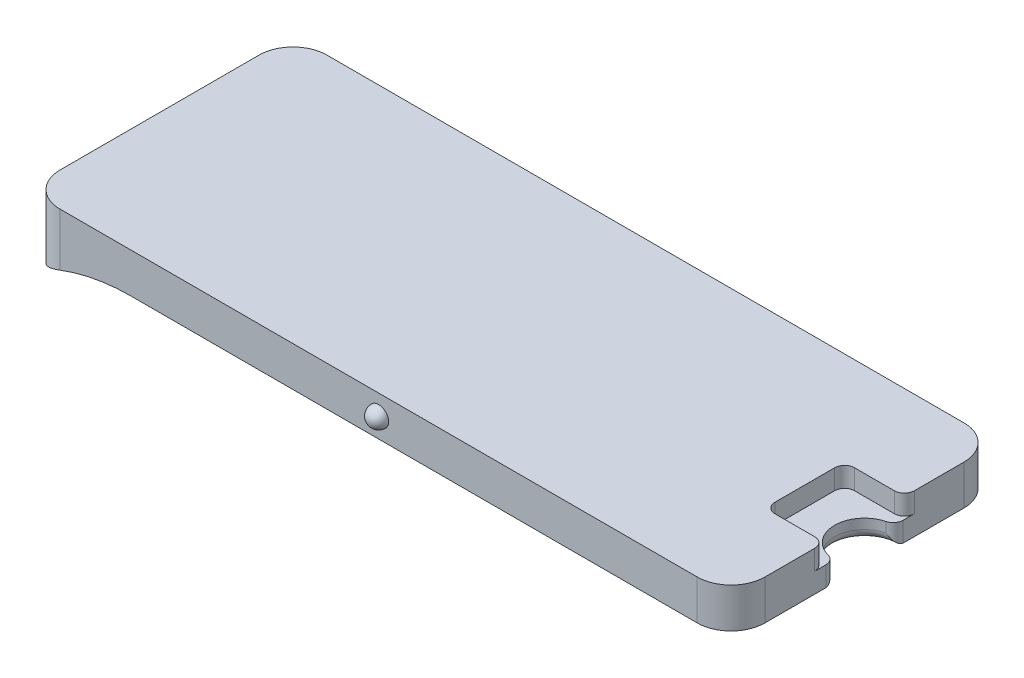
ISO-10303-21;
HEADER;
FILE_DESCRIPTION(('STEP AP214'),'2;1');
FILE_NAME('part.step','',(''),(''),'','','');
FILE_SCHEMA(('AUTOMOTIVE_DESIGN { 1 0 10303 214 1 1 1 1 }'));
ENDSEC;
DATA;
#1=APPLICATION_CONTEXT('core data for automotive mechanical design processes');
#2=APPLICATION_PROTOCOL_DEFINITION('international standard','automotive_design',2000,#1);
#3=PRODUCT_CONTEXT('',#1,'mechanical');
#4=PRODUCT('Part','Part','',(#3));
#5=PRODUCT_RELATED_PRODUCT_CATEGORY('part','',(#4));
#6=PRODUCT_DEFINITION_FORMATION('','',#4);
#7=PRODUCT_DEFINITION_CONTEXT('part definition',#1,'design');
#8=PRODUCT_DEFINITION('design','',#6,#7);
#9=PRODUCT_DEFINITION_SHAPE('','',#8);
#10=(LENGTH_UNIT() NAMED_UNIT(*) SI_UNIT(.MILLI.,.METRE.));
#11=(NAMED_UNIT(*) PLANE_ANGLE_UNIT() SI_UNIT($,.RADIAN.));
#12=(NAMED_UNIT(*) SI_UNIT($,.STERADIAN.) SOLID_ANGLE_UNIT());
#13=UNCERTAINTY_MEASURE_WITH_UNIT(LENGTH_MEASURE(1.E-05),#10,'distance_accuracy_value','');
#14=(GEOMETRIC_REPRESENTATION_CONTEXT(3) GLOBAL_UNCERTAINTY_ASSIGNED_CONTEXT((#13)) GLOBAL_UNIT_ASSIGNED_CONTEXT((#10,
#11,#12)) REPRESENTATION_CONTEXT('',''));
#15=CARTESIAN_POINT('',(0.,0.,0.));
#16=DIRECTION('',(0.,0.,1.));
#17=DIRECTION('',(1.,0.,0.));
#18=AXIS2_PLACEMENT_3D('',#15,#16,#17);
#19=CARTESIAN_POINT('',(35.7,6.,-2.));
#20=DIRECTION('',(-1.,0.,0.));
#21=DIRECTION('',(0.,0.,1.));
#22=AXIS2_PLACEMENT_3D('',#19,#20,#21);
#23=PLANE('',#22);
#24=DIRECTION('',(0.,0.,-1.));
#25=VECTOR('',#24,1.);
#26=CARTESIAN_POINT('',(35.7,5.,-9.));
#27=LINE('',#26,#25);
#28=CARTESIAN_POINT('',(35.7,5.,-8.93649167310371));
#29=VERTEX_POINT('',#28);
#30=CARTESIAN_POINT('',(35.7,5.,-9.5));
#31=VERTEX_POINT('',#30);
#32=EDGE_CURVE('E429',#29,#31,#27,.T.);
#33=ORIENTED_EDGE('',*,*,#32,.F.);
#34=DIRECTION('',(0.,-1.,0.));
#35=VECTOR('',#34,1.);
#36=CARTESIAN_POINT('',(35.7,6.,-8.93649167310371));
#37=LINE('',#36,#35);
#38=CARTESIAN_POINT('',(35.7,4.00404970771776,-8.93649167310371));
#39=VERTEX_POINT('',#38);
#40=EDGE_CURVE('E345',#29,#39,#37,.T.);
#41=ORIENTED_EDGE('',*,*,#40,.T.);
#42=CARTESIAN_POINT('',(35.7,4.5,-9.));
#43=DIRECTION('',(-1.,0.,0.));
#44=DIRECTION('',(0.,0.,1.));
#45=AXIS2_PLACEMENT_3D('',#42,#43,#44);
#46=CIRCLE('',#45,0.5);
#47=CARTESIAN_POINT('',(35.7,4.,-9.));
#48=VERTEX_POINT('',#47);
#49=EDGE_CURVE('E342',#39,#48,#46,.F.);
#50=ORIENTED_EDGE('',*,*,#49,.T.);
#51=DIRECTION('',(0.,0.,-1.));
#52=VECTOR('',#51,1.);
#53=CARTESIAN_POINT('',(35.7,4.,-0.3));
#54=LINE('',#53,#52);
#55=CARTESIAN_POINT('',(35.7,4.,-12.));
#56=VERTEX_POINT('',#55);
#57=EDGE_CURVE('E217',#48,#56,#54,.T.);
#58=ORIENTED_EDGE('',*,*,#57,.T.);
#59=DIRECTION('',(0.,-1.,0.));
#60=VECTOR('',#59,1.);
#61=CARTESIAN_POINT('',(35.7,6.,-12.));
#62=LINE('',#61,#60);
#63=CARTESIAN_POINT('',(35.7,6.,-12.));
#64=VERTEX_POINT('',#63);
#65=EDGE_CURVE('E447',#64,#56,#62,.T.);
#66=ORIENTED_EDGE('',*,*,#65,.F.);
#67=DIRECTION('',(0.,0.,-1.));
#68=VECTOR('',#67,1.);
#69=CARTESIAN_POINT('',(35.7,6.,-2.));
#70=LINE('',#69,#68);
#71=CARTESIAN_POINT('',(35.7,6.,-9.5));
#72=VERTEX_POINT('',#71);
#73=EDGE_CURVE('E444',#72,#64,#70,.T.);
#74=ORIENTED_EDGE('',*,*,#73,.F.);
#75=DIRECTION('',(0.,1.,0.));
#76=VECTOR('',#75,1.);
#77=CARTESIAN_POINT('',(35.7,6.,-9.5));
#78=LINE('',#77,#76);
#79=EDGE_CURVE('E339',#72,#31,#78,.F.);
#80=ORIENTED_EDGE('',*,*,#79,.T.);
#81=EDGE_LOOP('',(#33,#41,#50,#58,#66,#74,#80));
#82=FACE_BOUND('',#81,.T.);
#83=ADVANCED_FACE('F39',(#82),#23,.F.);
#84=CARTESIAN_POINT('',(2.00000000000001,6.,-0.3));
#85=DIRECTION('',(0.,0.,-1.));
#86=DIRECTION('',(-1.,0.,0.));
#87=AXIS2_PLACEMENT_3D('',#84,#85,#86);
#88=PLANE('',#87);
#89=CARTESIAN_POINT('',(18.,5.,-0.3));
#90=DIRECTION('',(0.,0.,-1.));
#91=DIRECTION('',(-1.,0.,0.));
#92=AXIS2_PLACEMENT_3D('',#89,#90,#91);
#93=CIRCLE('',#92,0.5);
#94=CARTESIAN_POINT('',(17.5,5.,-0.3));
#95=VERTEX_POINT('',#94);
#96=EDGE_CURVE('E492',#95,#95,#93,.F.);
#97=ORIENTED_EDGE('',*,*,#96,.F.);
#98=EDGE_LOOP('',(#97));
#99=FACE_BOUND('',#98,.T.);
#100=DIRECTION('',(-1.,0.,0.));
#101=VECTOR('',#100,1.);
#102=CARTESIAN_POINT('',(0.,4.,-0.299999999999996));
#103=LINE('',#102,#101);
#104=CARTESIAN_POINT('',(34.,4.,-0.3));
#105=VERTEX_POINT('',#104);
#106=CARTESIAN_POINT('',(5.56356447414131,4.,-0.299999999999996));
#107=VERTEX_POINT('',#106);
#108=EDGE_CURVE('E198',#105,#107,#103,.T.);
#109=ORIENTED_EDGE('',*,*,#108,.F.);
#110=DIRECTION('',(0.,-1.,0.));
#111=VECTOR('',#110,1.);
#112=CARTESIAN_POINT('',(34.,6.,-0.3));
#113=LINE('',#112,#111);
#114=CARTESIAN_POINT('',(34.,6.,-0.3));
#115=VERTEX_POINT('',#114);
#116=EDGE_CURVE('E480',#115,#105,#113,.T.);
#117=ORIENTED_EDGE('',*,*,#116,.F.);
#118=DIRECTION('',(1.,0.,0.));
#119=VECTOR('',#118,1.);
#120=CARTESIAN_POINT('',(2.00000000000001,6.,-0.3));
#121=LINE('',#120,#119);
#122=CARTESIAN_POINT('',(2.00000000000001,6.,-0.3));
#123=VERTEX_POINT('',#122);
#124=EDGE_CURVE('E454',#123,#115,#121,.T.);
#125=ORIENTED_EDGE('',*,*,#124,.F.);
#126=DIRECTION('',(0.,-1.,0.));
#127=VECTOR('',#126,1.);
#128=CARTESIAN_POINT('',(2.00000000000001,6.,-0.3));
#129=LINE('',#128,#127);
#130=CARTESIAN_POINT('',(2.00000000000001,3.34350085560214,-0.299999999999996));
#131=VERTEX_POINT('',#130);
#132=EDGE_CURVE('E222',#123,#131,#129,.T.);
#133=ORIENTED_EDGE('',*,*,#132,.T.);
#134=CARTESIAN_POINT('',(5.56356447414131,-6.,-0.299999999999996));
#135=DIRECTION('',(0.,0.,-1.));
#136=DIRECTION('',(-1.,0.,0.));
#137=AXIS2_PLACEMENT_3D('',#134,#135,#136);
#138=CIRCLE('',#137,10.);
#139=EDGE_CURVE('E210',#131,#107,#138,.T.);
#140=ORIENTED_EDGE('',*,*,#139,.T.);
#141=EDGE_LOOP('',(#109,#117,#125,#133,#140));
#142=FACE_BOUND('',#141,.T.);
#143=ADVANCED_FACE('F220',(#99,#142),#88,.F.);
#144=CARTESIAN_POINT('',(34.,6.,-2.));
#145=DIRECTION('',(0.,-1.,0.));
#146=DIRECTION('',(0.,0.,-1.));
#147=AXIS2_PLACEMENT_3D('',#144,#145,#146);
#148=CYLINDRICAL_SURFACE('',#147,1.7);
#149=CARTESIAN_POINT('',(34.,4.,-2.));
#150=DIRECTION('',(0.,-1.,0.));
#151=DIRECTION('',(1.,0.,0.));
#152=AXIS2_PLACEMENT_3D('',#149,#150,#151);
#153=CIRCLE('',#152,1.7);
#154=CARTESIAN_POINT('',(35.7,4.,-2.));
#155=VERTEX_POINT('',#154);
#156=EDGE_CURVE('E205',#155,#105,#153,.T.);
#157=ORIENTED_EDGE('',*,*,#156,.F.);
#158=DIRECTION('',(0.,-1.,0.));
#159=VECTOR('',#158,1.);
#160=CARTESIAN_POINT('',(35.7,6.,-2.));
#161=LINE('',#160,#159);
#162=CARTESIAN_POINT('',(35.7,6.,-2.));
#163=VERTEX_POINT('',#162);
#164=EDGE_CURVE('E478',#163,#155,#161,.T.);
#165=ORIENTED_EDGE('',*,*,#164,.F.);
#166=CARTESIAN_POINT('',(34.,6.,-2.));
#167=DIRECTION('',(0.,1.,0.));
#168=DIRECTION('',(0.,0.,-1.));
#169=AXIS2_PLACEMENT_3D('',#166,#167,#168);
#170=CIRCLE('',#169,1.7);
#171=EDGE_CURVE('E450',#115,#163,#170,.T.);
#172=ORIENTED_EDGE('',*,*,#171,.F.);
#173=ORIENTED_EDGE('',*,*,#116,.T.);
#174=EDGE_LOOP('',(#157,#165,#172,#173));
#175=FACE_BOUND('',#174,.T.);
#176=ADVANCED_FACE('F285',(#175),#148,.T.);
#177=CARTESIAN_POINT('',(35.7,4.5,-5.));
#178=DIRECTION('',(-1.,0.,0.));
#179=DIRECTION('',(0.,0.,1.));
#180=AXIS2_PLACEMENT_3D('',#177,#178,#179);
#181=CIRCLE('',#180,0.5);
#182=CARTESIAN_POINT('',(35.7,4.,-5.));
#183=VERTEX_POINT('',#182);
#184=CARTESIAN_POINT('',(35.7,4.00404970771776,-5.06350832689629));
#185=VERTEX_POINT('',#184);
#186=EDGE_CURVE('E303',#183,#185,#181,.F.);
#187=ORIENTED_EDGE('',*,*,#186,.T.);
#188=DIRECTION('',(0.,-1.,0.));
#189=VECTOR('',#188,1.);
#190=CARTESIAN_POINT('',(35.7,6.,-5.06350832689629));
#191=LINE('',#190,#189);
#192=CARTESIAN_POINT('',(35.7,5.,-5.06350832689629));
#193=VERTEX_POINT('',#192);
#194=EDGE_CURVE('E306',#185,#193,#191,.F.);
#195=ORIENTED_EDGE('',*,*,#194,.T.);
#196=CARTESIAN_POINT('',(35.7,5.,-4.5));
#197=VERTEX_POINT('',#196);
#198=EDGE_CURVE('E431',#197,#193,#27,.T.);
#199=ORIENTED_EDGE('',*,*,#198,.F.);
#200=DIRECTION('',(0.,1.,0.));
#201=VECTOR('',#200,1.);
#202=CARTESIAN_POINT('',(35.7,6.,-4.5));
#203=LINE('',#202,#201);
#204=CARTESIAN_POINT('',(35.7,6.,-4.5));
#205=VERTEX_POINT('',#204);
#206=EDGE_CURVE('E311',#197,#205,#203,.T.);
#207=ORIENTED_EDGE('',*,*,#206,.T.);
#208=EDGE_CURVE('E449',#163,#205,#70,.T.);
#209=ORIENTED_EDGE('',*,*,#208,.F.);
#210=ORIENTED_EDGE('',*,*,#164,.T.);
#211=EDGE_CURVE('E232',#155,#183,#54,.T.);
#212=ORIENTED_EDGE('',*,*,#211,.T.);
#213=EDGE_LOOP('',(#187,#195,#199,#207,#209,#210,#212));
#214=FACE_BOUND('',#213,.T.);
#215=ADVANCED_FACE('F279',(#214),#23,.F.);
#216=CARTESIAN_POINT('',(34.,6.,-12.));
#217=DIRECTION('',(0.,-1.,0.));
#218=DIRECTION('',(0.,0.,-1.));
#219=AXIS2_PLACEMENT_3D('',#216,#217,#218);
#220=CYLINDRICAL_SURFACE('',#219,1.7);
#221=CARTESIAN_POINT('',(34.,4.,-12.));
#222=DIRECTION('',(0.,-1.,0.));
#223=DIRECTION('',(1.,0.,0.));
#224=AXIS2_PLACEMENT_3D('',#221,#222,#223);
#225=CIRCLE('',#224,1.7);
#226=CARTESIAN_POINT('',(34.,4.,-13.7));
#227=VERTEX_POINT('',#226);
#228=EDGE_CURVE('E505',#227,#56,#225,.T.);
#229=ORIENTED_EDGE('',*,*,#228,.F.);
#230=DIRECTION('',(0.,-1.,0.));
#231=VECTOR('',#230,1.);
#232=CARTESIAN_POINT('',(34.,6.,-13.7));
#233=LINE('',#232,#231);
#234=CARTESIAN_POINT('',(34.,6.,-13.7));
#235=VERTEX_POINT('',#234);
#236=EDGE_CURVE('E474',#235,#227,#233,.T.);
#237=ORIENTED_EDGE('',*,*,#236,.F.);
#238=CARTESIAN_POINT('',(34.,6.,-12.));
#239=DIRECTION('',(0.,1.,0.));
#240=DIRECTION('',(0.,0.,1.));
#241=AXIS2_PLACEMENT_3D('',#238,#239,#240);
#242=CIRCLE('',#241,1.7);
#243=EDGE_CURVE('E453',#64,#235,#242,.T.);
#244=ORIENTED_EDGE('',*,*,#243,.F.);
#245=ORIENTED_EDGE('',*,*,#65,.T.);
#246=EDGE_LOOP('',(#229,#237,#244,#245));
#247=FACE_BOUND('',#246,.T.);
#248=ADVANCED_FACE('F291',(#247),#220,.T.);
#249=CARTESIAN_POINT('',(2.,6.,-13.7));
#250=DIRECTION('',(0.,0.,1.));
#251=DIRECTION('',(1.,0.,0.));
#252=AXIS2_PLACEMENT_3D('',#249,#250,#251);
#253=PLANE('',#252);
#254=CARTESIAN_POINT('',(18.,5.,-13.7));
#255=DIRECTION('',(0.,0.,1.));
#256=DIRECTION('',(1.,0.,0.));
#257=AXIS2_PLACEMENT_3D('',#254,#255,#256);
#258=CIRCLE('',#257,0.5);
#259=CARTESIAN_POINT('',(18.5,5.,-13.7));
#260=VERTEX_POINT('',#259);
#261=EDGE_CURVE('E486',#260,#260,#258,.F.);
#262=ORIENTED_EDGE('',*,*,#261,.F.);
#263=EDGE_LOOP('',(#262));
#264=FACE_BOUND('',#263,.T.);
#265=DIRECTION('',(-1.,0.,0.));
#266=VECTOR('',#265,1.);
#267=CARTESIAN_POINT('',(0.,4.,-13.7));
#268=LINE('',#267,#266);
#269=CARTESIAN_POINT('',(5.56356447414131,4.,-13.7));
#270=VERTEX_POINT('',#269);
#271=EDGE_CURVE('E223',#227,#270,#268,.T.);
#272=ORIENTED_EDGE('',*,*,#271,.T.);
#273=CARTESIAN_POINT('',(5.56356447414131,-6.,-13.7));
#274=DIRECTION('',(0.,0.,-1.));
#275=DIRECTION('',(-1.,0.,0.));
#276=AXIS2_PLACEMENT_3D('',#273,#274,#275);
#277=CIRCLE('',#276,10.);
#278=CARTESIAN_POINT('',(2.,3.34350085560214,-13.7));
#279=VERTEX_POINT('',#278);
#280=EDGE_CURVE('E216',#279,#270,#277,.T.);
#281=ORIENTED_EDGE('',*,*,#280,.F.);
#282=DIRECTION('',(0.,-1.,0.));
#283=VECTOR('',#282,1.);
#284=CARTESIAN_POINT('',(2.,6.,-13.7));
#285=LINE('',#284,#283);
#286=CARTESIAN_POINT('',(2.,6.,-13.7));
#287=VERTEX_POINT('',#286);
#288=EDGE_CURVE('E471',#287,#279,#285,.T.);
#289=ORIENTED_EDGE('',*,*,#288,.F.);
#290=DIRECTION('',(-1.,0.,0.));
#291=VECTOR('',#290,1.);
#292=CARTESIAN_POINT('',(2.,6.,-13.7));
#293=LINE('',#292,#291);
#294=EDGE_CURVE('E459',#235,#287,#293,.T.);
#295=ORIENTED_EDGE('',*,*,#294,.F.);
#296=ORIENTED_EDGE('',*,*,#236,.T.);
#297=EDGE_LOOP('',(#272,#281,#289,#295,#296));
#298=FACE_BOUND('',#297,.T.);
#299=ADVANCED_FACE('F297',(#264,#298),#253,.F.);
#300=CARTESIAN_POINT('',(2.,6.,-2.));
#301=DIRECTION('',(0.,-1.,0.));
#302=DIRECTION('',(0.,0.,-1.));
#303=AXIS2_PLACEMENT_3D('',#300,#301,#302);
#304=CYLINDRICAL_SURFACE('',#303,1.7);
#305=DIRECTION('',(0.,-1.,0.));
#306=VECTOR('',#305,1.);
#307=CARTESIAN_POINT('',(0.3,6.,-2.00000000000001));
#308=LINE('',#307,#306);
#309=CARTESIAN_POINT('',(0.3,6.,-2.00000000000001));
#310=VERTEX_POINT('',#309);
#311=CARTESIAN_POINT('',(0.3,2.50264012095993,-2.00000000000001));
#312=VERTEX_POINT('',#311);
#313=EDGE_CURVE('E465',#310,#312,#308,.T.);
#314=ORIENTED_EDGE('',*,*,#313,.T.);
#315=CARTESIAN_POINT('',(0.3,2.50264012095993,-2.00000000000001));
#316=CARTESIAN_POINT('',(0.299992088526312,2.50263250156881,-1.95678362515802));
#317=CARTESIAN_POINT('',(0.301647690929297,2.50366006360953,-1.91357279448062));
#318=CARTESIAN_POINT('',(0.308224758263679,2.50772776157053,-1.82751564458058));
#319=CARTESIAN_POINT('',(0.31314467794515,2.51076694523549,-1.784669162599));
#320=CARTESIAN_POINT('',(0.326154818890052,2.51877895107439,-1.69987747715473));
#321=CARTESIAN_POINT('',(0.334228132251549,2.52374145966233,-1.65792870504246));
#322=CARTESIAN_POINT('',(0.353429568358974,2.53549181946785,-1.57500643976369));
#323=CARTESIAN_POINT('',(0.364557923805424,2.54227980973035,-1.53403302114767));
#324=CARTESIAN_POINT('',(0.402291671563425,2.5651698553777,-1.41311619137803));
#325=CARTESIAN_POINT('',(0.433278566370444,2.58381862292436,-1.33496744687166));
#326=CARTESIAN_POINT('',(0.505629285829037,2.62664769482306,-1.18526401776579));
#327=CARTESIAN_POINT('',(0.547005658001135,2.65083468463093,-1.11371745063029));
#328=CARTESIAN_POINT('',(0.641988142789804,2.70524443898162,-0.973620414061437));
#329=CARTESIAN_POINT('',(0.696249026896962,2.73577178135987,-0.905633155991113));
#330=CARTESIAN_POINT('',(0.813515411197208,2.80008576541857,-0.779474437184878));
#331=CARTESIAN_POINT('',(0.876524533238714,2.83387375526024,-0.721307064185352));
#332=CARTESIAN_POINT('',(1.019051832355,2.90812555071934,-0.608199277374127));
#333=CARTESIAN_POINT('',(1.09964892968965,2.94886909809408,-0.554797721102043));
#334=CARTESIAN_POINT('',(1.26838831125863,3.03107285023993,-0.462469042166749));
#335=CARTESIAN_POINT('',(1.35653148750248,3.07253313927232,-0.423543633619444));
#336=CARTESIAN_POINT('',(1.53562179025118,3.15341503303893,-0.362006866611179));
#337=CARTESIAN_POINT('',(1.62639383526513,3.19285976533429,-0.338921406706068));
#338=CARTESIAN_POINT('',(1.76498924936879,3.25058637639422,-0.315668902807397));
#339=CARTESIAN_POINT('',(1.81161528615953,3.26959665612123,-0.309813945833303));
#340=CARTESIAN_POINT('',(1.90544027189988,3.30702339044014,-0.301979678796387));
#341=CARTESIAN_POINT('',(1.95263935663324,3.32543970035591,-0.30000130606422));
#342=CARTESIAN_POINT('',(2.00000000000001,3.34350085560214,-0.3));
#343=B_SPLINE_CURVE_WITH_KNOTS('',3,(#315,#316,#317,#318,#319,#320,#321,#322,#323,#324,#325,
#326,#327,#328,#329,#330,#331,#332,#333,#334,#335,#336,#337,#338,#339,#340,#341,#342),
.UNSPECIFIED.,.F.,.F.,(4,2,2,2,2,2,2,2,2,2,2,2,2,4),(0.,0.129596054597615,0.25913080524233,
0.38798034410827,0.516839700082238,0.773929553596661,1.03133140428817,1.3068088043476,
1.58240059649021,1.89582060505091,2.20927771376466,2.51288731577628,2.66482771633682,
2.81680485048054),.UNSPECIFIED.);
#344=EDGE_CURVE('E244',#312,#131,#343,.T.);
#345=ORIENTED_EDGE('',*,*,#344,.T.);
#346=ORIENTED_EDGE('',*,*,#132,.F.);
#347=CARTESIAN_POINT('',(2.,6.,-2.));
#348=DIRECTION('',(0.,1.,0.));
#349=DIRECTION('',(0.,0.,1.));
#350=AXIS2_PLACEMENT_3D('',#347,#348,#349);
#351=CIRCLE('',#350,1.7);
#352=EDGE_CURVE('E504',#310,#123,#351,.T.);
#353=ORIENTED_EDGE('',*,*,#352,.F.);
#354=EDGE_LOOP('',(#314,#345,#346,#353));
#355=FACE_BOUND('',#354,.T.);
#356=ADVANCED_FACE('F272',(#355),#304,.T.);
#357=CARTESIAN_POINT('',(2.,6.,-12.));
#358=DIRECTION('',(0.,-1.,0.));
#359=DIRECTION('',(0.,0.,-1.));
#360=AXIS2_PLACEMENT_3D('',#357,#358,#359);
#361=CYLINDRICAL_SURFACE('',#360,1.7);
#362=ORIENTED_EDGE('',*,*,#288,.T.);
#363=CARTESIAN_POINT('',(2.,3.34350085560214,-13.7));
#364=CARTESIAN_POINT('',(1.94792819045312,3.32364375244172,-13.6999980232305));
#365=CARTESIAN_POINT('',(1.89605549079867,3.30335776435633,-13.6976067884927));
#366=CARTESIAN_POINT('',(1.79303683749702,3.26208355128369,-13.6881481374563));
#367=CARTESIAN_POINT('',(1.74189068055667,3.24109552847475,-13.6810820566394));
#368=CARTESIAN_POINT('',(1.5901615264663,3.17736619294704,-13.6530545575874));
#369=CARTESIAN_POINT('',(1.49110935180458,3.1337913366733,-13.6252631614737));
#370=CARTESIAN_POINT('',(1.29992431149841,3.04612932773585,-13.5525348779413));
#371=CARTESIAN_POINT('',(1.20778705310864,3.00204252120489,-13.5076089875647));
#372=CARTESIAN_POINT('',(1.03254452622709,2.91512334063785,-13.4016120521645));
#373=CARTESIAN_POINT('',(0.949443647760335,2.87229158364213,-13.3405332087798));
#374=CARTESIAN_POINT('',(0.793955205982153,2.7896904782686,-13.2026443682722));
#375=CARTESIAN_POINT('',(0.721677261953914,2.74995419649219,-13.125690031179));
#376=CARTESIAN_POINT('',(0.591525964679095,2.67665941554074,-12.957846171416));
#377=CARTESIAN_POINT('',(0.533646198947455,2.6430981679445,-12.8669628815046));
#378=CARTESIAN_POINT('',(0.439788704568335,2.58776130195992,-12.6822330343962));
#379=CARTESIAN_POINT('',(0.402295920901943,2.56519047679602,-12.5894109237829));
#380=CARTESIAN_POINT('',(0.358580923878363,2.53864319917993,-12.4452789002976));
#381=CARTESIAN_POINT('',(0.346101170279315,2.53101517306994,-12.3964558137264));
#382=CARTESIAN_POINT('',(0.325488774388549,2.51837496682933,-12.2975805789907));
#383=CARTESIAN_POINT('',(0.317352918191649,2.51336085281716,-12.2475293682329));
#384=CARTESIAN_POINT('',(0.307653228700817,2.50737424289005,-12.1644573894644));
#385=CARTESIAN_POINT('',(0.304784341297359,2.50560050728296,-12.1316384479323));
#386=CARTESIAN_POINT('',(0.30095790539493,2.50323313535122,-12.0658819390144));
#387=CARTESIAN_POINT('',(0.299998340992629,2.5026382543698,-12.032944533567));
#388=CARTESIAN_POINT('',(0.3,2.50264012095993,-12.));
#389=B_SPLINE_CURVE_WITH_KNOTS('',3,(#363,#364,#365,#366,#367,#368,#369,#370,#371,#372,#373,
#374,#375,#376,#377,#378,#379,#380,#381,#382,#383,#384,#385,#386,#387,#388),.UNSPECIFIED.,.F.,
.F.,(4,2,2,2,2,2,2,2,2,2,2,2,4),(0.,0.167073375462505,0.334099043012843,0.667584472945943,
1.0008562287181,1.33428917687771,1.67089903857283,2.00735871558599,2.31316289322455,
2.46584238806353,2.61840876333638,2.71731373139614,2.81611421798484),.UNSPECIFIED.);
#390=CARTESIAN_POINT('',(0.299999999999999,2.50264012095993,-12.));
#391=VERTEX_POINT('',#390);
#392=EDGE_CURVE('E234',#279,#391,#389,.T.);
#393=ORIENTED_EDGE('',*,*,#392,.T.);
#394=DIRECTION('',(0.,-1.,0.));
#395=VECTOR('',#394,1.);
#396=CARTESIAN_POINT('',(0.3,6.,-12.));
#397=LINE('',#396,#395);
#398=CARTESIAN_POINT('',(0.3,6.,-12.));
#399=VERTEX_POINT('',#398);
#400=EDGE_CURVE('E468',#399,#391,#397,.T.);
#401=ORIENTED_EDGE('',*,*,#400,.F.);
#402=CARTESIAN_POINT('',(2.,6.,-12.));
#403=DIRECTION('',(0.,1.,0.));
#404=DIRECTION('',(0.,0.,1.));
#405=AXIS2_PLACEMENT_3D('',#402,#403,#404);
#406=CIRCLE('',#405,1.7);
#407=EDGE_CURVE('E461',#287,#399,#406,.T.);
#408=ORIENTED_EDGE('',*,*,#407,.F.);
#409=EDGE_LOOP('',(#362,#393,#401,#408));
#410=FACE_BOUND('',#409,.T.);
#411=ADVANCED_FACE('F251',(#410),#361,.T.);
#412=CARTESIAN_POINT('',(0.3,6.,-2.00000000000001));
#413=DIRECTION('',(1.,0.,0.));
#414=DIRECTION('',(0.,0.,-1.));
#415=AXIS2_PLACEMENT_3D('',#412,#413,#414);
#416=PLANE('',#415);
#417=CARTESIAN_POINT('',(0.3,4.25132006047996,-7.00000000000001));
#418=DIRECTION('',(1.,0.,0.));
#419=DIRECTION('',(0.,0.,-1.));
#420=AXIS2_PLACEMENT_3D('',#417,#418,#419);
#421=CIRCLE('',#420,0.5);
#422=CARTESIAN_POINT('',(0.3,4.25132006047996,-7.50000000000001));
#423=VERTEX_POINT('',#422);
#424=EDGE_CURVE('E489',#423,#423,#421,.F.);
#425=ORIENTED_EDGE('',*,*,#424,.F.);
#426=EDGE_LOOP('',(#425));
#427=FACE_BOUND('',#426,.T.);
#428=ORIENTED_EDGE('',*,*,#400,.T.);
#429=DIRECTION('',(0.,0.,-1.));
#430=VECTOR('',#429,1.);
#431=CARTESIAN_POINT('',(0.3,2.50264012095993,-0.299999999999996));
#432=LINE('',#431,#430);
#433=EDGE_CURVE('E483',#391,#312,#432,.F.);
#434=ORIENTED_EDGE('',*,*,#433,.T.);
#435=ORIENTED_EDGE('',*,*,#313,.F.);
#436=DIRECTION('',(0.,0.,1.));
#437=VECTOR('',#436,1.);
#438=CARTESIAN_POINT('',(0.3,6.,-2.00000000000001));
#439=LINE('',#438,#437);
#440=EDGE_CURVE('E463',#399,#310,#439,.T.);
#441=ORIENTED_EDGE('',*,*,#440,.F.);
#442=EDGE_LOOP('',(#428,#434,#435,#441));
#443=FACE_BOUND('',#442,.T.);
#444=ADVANCED_FACE('F264',(#427,#443),#416,.F.);
#445=CARTESIAN_POINT('',(2.,6.,-2.));
#446=DIRECTION('',(0.,1.,0.));
#447=DIRECTION('',(0.,0.,1.));
#448=AXIS2_PLACEMENT_3D('',#445,#446,#447);
#449=PLANE('',#448);
#450=DIRECTION('',(-1.,0.,0.));
#451=VECTOR('',#450,1.);
#452=CARTESIAN_POINT('',(35.7,6.,-9.));
#453=LINE('',#452,#451);
#454=CARTESIAN_POINT('',(35.2,6.,-9.));
#455=VERTEX_POINT('',#454);
#456=CARTESIAN_POINT('',(33.2,6.,-9.));
#457=VERTEX_POINT('',#456);
#458=EDGE_CURVE('E424',#455,#457,#453,.T.);
#459=ORIENTED_EDGE('',*,*,#458,.F.);
#460=CARTESIAN_POINT('',(35.2,6.,-9.5));
#461=DIRECTION('',(0.,1.,0.));
#462=DIRECTION('',(0.,0.,1.));
#463=AXIS2_PLACEMENT_3D('',#460,#461,#462);
#464=CIRCLE('',#463,0.5);
#465=EDGE_CURVE('E359',#455,#72,#464,.T.);
#466=ORIENTED_EDGE('',*,*,#465,.T.);
#467=ORIENTED_EDGE('',*,*,#73,.T.);
#468=ORIENTED_EDGE('',*,*,#243,.T.);
#469=ORIENTED_EDGE('',*,*,#294,.T.);
#470=ORIENTED_EDGE('',*,*,#407,.T.);
#471=ORIENTED_EDGE('',*,*,#440,.T.);
#472=ORIENTED_EDGE('',*,*,#352,.T.);
#473=ORIENTED_EDGE('',*,*,#124,.T.);
#474=ORIENTED_EDGE('',*,*,#171,.T.);
#475=ORIENTED_EDGE('',*,*,#208,.T.);
#476=CARTESIAN_POINT('',(35.2,6.,-4.5));
#477=DIRECTION('',(0.,1.,0.));
#478=DIRECTION('',(0.,0.,1.));
#479=AXIS2_PLACEMENT_3D('',#476,#477,#478);
#480=CIRCLE('',#479,0.5);
#481=CARTESIAN_POINT('',(35.2,6.,-5.));
#482=VERTEX_POINT('',#481);
#483=EDGE_CURVE('E357',#205,#482,#480,.T.);
#484=ORIENTED_EDGE('',*,*,#483,.T.);
#485=DIRECTION('',(1.,0.,0.));
#486=VECTOR('',#485,1.);
#487=CARTESIAN_POINT('',(35.7,6.,-5.));
#488=LINE('',#487,#486);
#489=CARTESIAN_POINT('',(33.2,6.,-5.));
#490=VERTEX_POINT('',#489);
#491=EDGE_CURVE('E227',#490,#482,#488,.T.);
#492=ORIENTED_EDGE('',*,*,#491,.F.);
#493=CARTESIAN_POINT('',(33.2,6.,-5.5));
#494=DIRECTION('',(0.,1.,0.));
#495=DIRECTION('',(0.,0.,1.));
#496=AXIS2_PLACEMENT_3D('',#493,#494,#495);
#497=CIRCLE('',#496,0.5);
#498=CARTESIAN_POINT('',(32.7,6.,-5.5));
#499=VERTEX_POINT('',#498);
#500=EDGE_CURVE('E54',#490,#499,#497,.F.);
#501=ORIENTED_EDGE('',*,*,#500,.T.);
#502=DIRECTION('',(0.,0.,1.));
#503=VECTOR('',#502,1.);
#504=CARTESIAN_POINT('',(32.7,6.,-9.));
#505=LINE('',#504,#503);
#506=CARTESIAN_POINT('',(32.7,6.,-8.5));
#507=VERTEX_POINT('',#506);
#508=EDGE_CURVE('E427',#507,#499,#505,.T.);
#509=ORIENTED_EDGE('',*,*,#508,.F.);
#510=CARTESIAN_POINT('',(33.2,6.,-8.5));
#511=DIRECTION('',(0.,1.,0.));
#512=DIRECTION('',(0.,0.,1.));
#513=AXIS2_PLACEMENT_3D('',#510,#511,#512);
#514=CIRCLE('',#513,0.5);
#515=EDGE_CURVE('E11',#507,#457,#514,.F.);
#516=ORIENTED_EDGE('',*,*,#515,.T.);
#517=EDGE_LOOP('',(#459,#466,#467,#468,#469,#470,#471,#472,#473,#474,#475,#484,#492,#501,#509,#516));
#518=FACE_BOUND('',#517,.T.);
#519=ADVANCED_FACE('F261',(#518),#449,.T.);
#520=CARTESIAN_POINT('',(0.,4.,-0.299999999999996));
#521=DIRECTION('',(0.,-1.,0.));
#522=DIRECTION('',(1.,0.,0.));
#523=AXIS2_PLACEMENT_3D('',#520,#521,#522);
#524=PLANE('',#523);
#525=ORIENTED_EDGE('',*,*,#57,.F.);
#526=CARTESIAN_POINT('',(35.7,4.,-7.));
#527=DIRECTION('',(0.,-1.,0.));
#528=DIRECTION('',(1.,0.,0.));
#529=AXIS2_PLACEMENT_3D('',#526,#527,#528);
#530=CIRCLE('',#529,2.);
#531=EDGE_CURVE('E348',#48,#183,#530,.F.);
#532=ORIENTED_EDGE('',*,*,#531,.T.);
#533=ORIENTED_EDGE('',*,*,#211,.F.);
#534=ORIENTED_EDGE('',*,*,#156,.T.);
#535=ORIENTED_EDGE('',*,*,#108,.T.);
#536=DIRECTION('',(0.,0.,-1.));
#537=VECTOR('',#536,1.);
#538=CARTESIAN_POINT('',(5.56356447414131,4.,-0.299999999999996));
#539=LINE('',#538,#537);
#540=EDGE_CURVE('E202',#107,#270,#539,.T.);
#541=ORIENTED_EDGE('',*,*,#540,.T.);
#542=ORIENTED_EDGE('',*,*,#271,.F.);
#543=ORIENTED_EDGE('',*,*,#228,.T.);
#544=EDGE_LOOP('',(#525,#532,#533,#534,#535,#541,#542,#543));
#545=FACE_BOUND('',#544,.T.);
#546=ADVANCED_FACE('F201',(#545),#524,.T.);
#547=CARTESIAN_POINT('',(5.56356447414131,-6.,-0.299999999999996));
#548=DIRECTION('',(0.,0.,-1.));
#549=DIRECTION('',(-1.,0.,0.));
#550=AXIS2_PLACEMENT_3D('',#547,#548,#549);
#551=CYLINDRICAL_SURFACE('',#550,10.);
#552=ORIENTED_EDGE('',*,*,#433,.F.);
#553=ORIENTED_EDGE('',*,*,#392,.F.);
#554=ORIENTED_EDGE('',*,*,#280,.T.);
#555=ORIENTED_EDGE('',*,*,#540,.F.);
#556=ORIENTED_EDGE('',*,*,#139,.F.);
#557=ORIENTED_EDGE('',*,*,#344,.F.);
#558=EDGE_LOOP('',(#552,#553,#554,#555,#556,#557));
#559=FACE_BOUND('',#558,.T.);
#560=ADVANCED_FACE('F213',(#559),#551,.F.);
#561=CARTESIAN_POINT('',(18.,5.,-13.7));
#562=DIRECTION('',(1.,0.,0.));
#563=DIRECTION('',(0.,1.,0.));
#564=AXIS2_PLACEMENT_3D('',#561,#562,#563);
#565=SPHERICAL_SURFACE('',#564,0.5);
#566=CARTESIAN_POINT('',(18.,5.,-13.7));
#567=DIRECTION('',(0.,0.,1.));
#568=DIRECTION('',(1.,0.,0.));
#569=AXIS2_PLACEMENT_3D('',#566,#567,#568);
#570=SPHERICAL_SURFACE('',#569,0.5);
#571=ORIENTED_EDGE('',*,*,#261,.T.);
#572=EDGE_LOOP('',(#571));
#573=FACE_BOUND('',#572,.T.);
#574=ADVANCED_FACE('F259',(#573),#570,.T.);
#575=CARTESIAN_POINT('',(0.3,4.25132006047996,-7.00000000000001));
#576=DIRECTION('',(0.,-1.,0.));
#577=DIRECTION('',(0.,0.,-1.));
#578=AXIS2_PLACEMENT_3D('',#575,#576,#577);
#579=SPHERICAL_SURFACE('',#578,0.5);
#580=CARTESIAN_POINT('',(0.3,4.25132006047996,-7.00000000000001));
#581=DIRECTION('',(1.,0.,0.));
#582=DIRECTION('',(0.,0.,-1.));
#583=AXIS2_PLACEMENT_3D('',#580,#581,#582);
#584=SPHERICAL_SURFACE('',#583,0.5);
#585=ORIENTED_EDGE('',*,*,#424,.T.);
#586=EDGE_LOOP('',(#585));
#587=FACE_BOUND('',#586,.T.);
#588=ADVANCED_FACE('F529',(#587),#584,.T.);
#589=CARTESIAN_POINT('',(18.,5.,-0.3));
#590=DIRECTION('',(1.,0.,0.));
#591=DIRECTION('',(0.,1.,0.));
#592=AXIS2_PLACEMENT_3D('',#589,#590,#591);
#593=SPHERICAL_SURFACE('',#592,0.5);
#594=CARTESIAN_POINT('',(18.,5.,-0.3));
#595=DIRECTION('',(0.,0.,-1.));
#596=DIRECTION('',(-1.,0.,0.));
#597=AXIS2_PLACEMENT_3D('',#594,#595,#596);
#598=SPHERICAL_SURFACE('',#597,0.5);
#599=ORIENTED_EDGE('',*,*,#96,.T.);
#600=EDGE_LOOP('',(#599));
#601=FACE_BOUND('',#600,.T.);
#602=ADVANCED_FACE('F532',(#601),#598,.T.);
#603=CARTESIAN_POINT('',(35.7,6.,-7.));
#604=DIRECTION('',(0.,-1.,0.));
#605=DIRECTION('',(1.,0.,0.));
#606=AXIS2_PLACEMENT_3D('',#603,#604,#605);
#607=CYLINDRICAL_SURFACE('',#606,1.5);
#608=CARTESIAN_POINT('',(35.7,5.,-7.));
#609=DIRECTION('',(0.,-1.,0.));
#610=DIRECTION('',(0.,0.,-1.));
#611=AXIS2_PLACEMENT_3D('',#608,#609,#610);
#612=CIRCLE('',#611,1.5);
#613=CARTESIAN_POINT('',(35.325,5.,-8.45236875482779));
#614=VERTEX_POINT('',#613);
#615=CARTESIAN_POINT('',(35.325,5.,-5.54763124517221));
#616=VERTEX_POINT('',#615);
#617=EDGE_CURVE('E495',#614,#616,#612,.F.);
#618=ORIENTED_EDGE('',*,*,#617,.T.);
#619=DIRECTION('',(0.,-1.,0.));
#620=VECTOR('',#619,1.);
#621=CARTESIAN_POINT('',(35.325,6.,-5.54763124517221));
#622=LINE('',#621,#620);
#623=CARTESIAN_POINT('',(35.325,4.5,-5.54763124517221));
#624=VERTEX_POINT('',#623);
#625=EDGE_CURVE('E337',#616,#624,#622,.T.);
#626=ORIENTED_EDGE('',*,*,#625,.T.);
#627=CARTESIAN_POINT('',(35.7,4.5,-7.));
#628=DIRECTION('',(0.,-1.,0.));
#629=DIRECTION('',(1.,0.,0.));
#630=AXIS2_PLACEMENT_3D('',#627,#628,#629);
#631=CIRCLE('',#630,1.5);
#632=CARTESIAN_POINT('',(35.325,4.5,-8.45236875482779));
#633=VERTEX_POINT('',#632);
#634=EDGE_CURVE('E318',#624,#633,#631,.T.);
#635=ORIENTED_EDGE('',*,*,#634,.T.);
#636=DIRECTION('',(0.,-1.,0.));
#637=VECTOR('',#636,1.);
#638=CARTESIAN_POINT('',(35.325,6.,-8.45236875482779));
#639=LINE('',#638,#637);
#640=EDGE_CURVE('E335',#633,#614,#639,.F.);
#641=ORIENTED_EDGE('',*,*,#640,.T.);
#642=EDGE_LOOP('',(#618,#626,#635,#641));
#643=FACE_BOUND('',#642,.T.);
#644=ADVANCED_FACE('F538',(#643),#607,.F.);
#645=CARTESIAN_POINT('',(0.,5.,0.));
#646=DIRECTION('',(0.,-1.,0.));
#647=DIRECTION('',(0.,0.,-1.));
#648=AXIS2_PLACEMENT_3D('',#645,#646,#647);
#649=PLANE('',#648);
#650=ORIENTED_EDGE('',*,*,#198,.T.);
#651=CARTESIAN_POINT('',(35.2,5.,-5.06350832689629));
#652=DIRECTION('',(0.,-1.,0.));
#653=DIRECTION('',(0.,0.,-1.));
#654=AXIS2_PLACEMENT_3D('',#651,#652,#653);
#655=CIRCLE('',#654,0.5);
#656=EDGE_CURVE('E322',#193,#616,#655,.F.);
#657=ORIENTED_EDGE('',*,*,#656,.T.);
#658=ORIENTED_EDGE('',*,*,#617,.F.);
#659=CARTESIAN_POINT('',(35.2,5.,-8.93649167310371));
#660=DIRECTION('',(0.,-1.,0.));
#661=DIRECTION('',(0.,0.,-1.));
#662=AXIS2_PLACEMENT_3D('',#659,#660,#661);
#663=CIRCLE('',#662,0.5);
#664=EDGE_CURVE('E330',#614,#29,#663,.F.);
#665=ORIENTED_EDGE('',*,*,#664,.T.);
#666=ORIENTED_EDGE('',*,*,#32,.T.);
#667=CARTESIAN_POINT('',(35.2,5.,-9.5));
#668=DIRECTION('',(0.,-1.,0.));
#669=DIRECTION('',(0.,0.,-1.));
#670=AXIS2_PLACEMENT_3D('',#667,#668,#669);
#671=CIRCLE('',#670,0.5);
#672=CARTESIAN_POINT('',(35.2,5.,-9.));
#673=VERTEX_POINT('',#672);
#674=EDGE_CURVE('E371',#31,#673,#671,.T.);
#675=ORIENTED_EDGE('',*,*,#674,.T.);
#676=DIRECTION('',(-1.,0.,0.));
#677=VECTOR('',#676,1.);
#678=CARTESIAN_POINT('',(35.7,5.,-9.));
#679=LINE('',#678,#677);
#680=CARTESIAN_POINT('',(33.2,5.,-9.));
#681=VERTEX_POINT('',#680);
#682=EDGE_CURVE('E420',#673,#681,#679,.T.);
#683=ORIENTED_EDGE('',*,*,#682,.T.);
#684=CARTESIAN_POINT('',(33.2,5.,-8.5));
#685=DIRECTION('',(0.,-1.,0.));
#686=DIRECTION('',(0.,0.,-1.));
#687=AXIS2_PLACEMENT_3D('',#684,#685,#686);
#688=CIRCLE('',#687,0.5);
#689=CARTESIAN_POINT('',(32.7,5.,-8.5));
#690=VERTEX_POINT('',#689);
#691=EDGE_CURVE('E323',#681,#690,#688,.F.);
#692=ORIENTED_EDGE('',*,*,#691,.T.);
#693=DIRECTION('',(0.,0.,1.));
#694=VECTOR('',#693,1.);
#695=CARTESIAN_POINT('',(32.7,5.,-9.));
#696=LINE('',#695,#694);
#697=CARTESIAN_POINT('',(32.7,5.,-5.5));
#698=VERTEX_POINT('',#697);
#699=EDGE_CURVE('E414',#690,#698,#696,.T.);
#700=ORIENTED_EDGE('',*,*,#699,.T.);
#701=CARTESIAN_POINT('',(33.2,5.,-5.5));
#702=DIRECTION('',(0.,-1.,0.));
#703=DIRECTION('',(0.,0.,-1.));
#704=AXIS2_PLACEMENT_3D('',#701,#702,#703);
#705=CIRCLE('',#704,0.5);
#706=CARTESIAN_POINT('',(33.2,5.,-5.));
#707=VERTEX_POINT('',#706);
#708=EDGE_CURVE('E325',#698,#707,#705,.F.);
#709=ORIENTED_EDGE('',*,*,#708,.T.);
#710=DIRECTION('',(1.,0.,0.));
#711=VECTOR('',#710,1.);
#712=CARTESIAN_POINT('',(35.7,5.,-5.));
#713=LINE('',#712,#711);
#714=CARTESIAN_POINT('',(35.2,5.,-5.));
#715=VERTEX_POINT('',#714);
#716=EDGE_CURVE('E230',#707,#715,#713,.T.);
#717=ORIENTED_EDGE('',*,*,#716,.T.);
#718=CARTESIAN_POINT('',(35.2,5.,-4.5));
#719=DIRECTION('',(0.,-1.,0.));
#720=DIRECTION('',(0.,0.,-1.));
#721=AXIS2_PLACEMENT_3D('',#718,#719,#720);
#722=CIRCLE('',#721,0.5);
#723=EDGE_CURVE('E373',#715,#197,#722,.T.);
#724=ORIENTED_EDGE('',*,*,#723,.T.);
#725=EDGE_LOOP('',(#650,#657,#658,#665,#666,#675,#683,#692,#700,#709,#717,#724));
#726=FACE_BOUND('',#725,.T.);
#727=ADVANCED_FACE('F411',(#726),#649,.F.);
#728=CARTESIAN_POINT('',(35.7,5.,-5.));
#729=DIRECTION('',(0.,0.,1.));
#730=DIRECTION('',(1.,0.,0.));
#731=AXIS2_PLACEMENT_3D('',#728,#729,#730);
#732=PLANE('',#731);
#733=ORIENTED_EDGE('',*,*,#491,.T.);
#734=DIRECTION('',(0.,1.,0.));
#735=VECTOR('',#734,1.);
#736=CARTESIAN_POINT('',(35.2,5.,-5.));
#737=LINE('',#736,#735);
#738=EDGE_CURVE('E365',#482,#715,#737,.F.);
#739=ORIENTED_EDGE('',*,*,#738,.T.);
#740=ORIENTED_EDGE('',*,*,#716,.F.);
#741=DIRECTION('',(0.,1.,0.));
#742=VECTOR('',#741,1.);
#743=CARTESIAN_POINT('',(33.2,6.,-5.));
#744=LINE('',#743,#742);
#745=EDGE_CURVE('E362',#707,#490,#744,.T.);
#746=ORIENTED_EDGE('',*,*,#745,.T.);
#747=EDGE_LOOP('',(#733,#739,#740,#746));
#748=FACE_BOUND('',#747,.T.);
#749=ADVANCED_FACE('F417',(#748),#732,.F.);
#750=CARTESIAN_POINT('',(32.7,5.,-9.));
#751=DIRECTION('',(-1.,0.,0.));
#752=DIRECTION('',(0.,0.,1.));
#753=AXIS2_PLACEMENT_3D('',#750,#751,#752);
#754=PLANE('',#753);
#755=ORIENTED_EDGE('',*,*,#508,.T.);
#756=DIRECTION('',(0.,1.,0.));
#757=VECTOR('',#756,1.);
#758=CARTESIAN_POINT('',(32.7,5.,-5.5));
#759=LINE('',#758,#757);
#760=EDGE_CURVE('E369',#499,#698,#759,.F.);
#761=ORIENTED_EDGE('',*,*,#760,.T.);
#762=ORIENTED_EDGE('',*,*,#699,.F.);
#763=DIRECTION('',(0.,1.,0.));
#764=VECTOR('',#763,1.);
#765=CARTESIAN_POINT('',(32.7,6.,-8.5));
#766=LINE('',#765,#764);
#767=EDGE_CURVE('E367',#690,#507,#766,.T.);
#768=ORIENTED_EDGE('',*,*,#767,.T.);
#769=EDGE_LOOP('',(#755,#761,#762,#768));
#770=FACE_BOUND('',#769,.T.);
#771=ADVANCED_FACE('F440',(#770),#754,.F.);
#772=CARTESIAN_POINT('',(35.7,5.,-9.));
#773=DIRECTION('',(0.,0.,-1.));
#774=DIRECTION('',(-1.,0.,0.));
#775=AXIS2_PLACEMENT_3D('',#772,#773,#774);
#776=PLANE('',#775);
#777=ORIENTED_EDGE('',*,*,#682,.F.);
#778=DIRECTION('',(0.,1.,0.));
#779=VECTOR('',#778,1.);
#780=CARTESIAN_POINT('',(35.2,5.,-9.));
#781=LINE('',#780,#779);
#782=EDGE_CURVE('E353',#673,#455,#781,.T.);
#783=ORIENTED_EDGE('',*,*,#782,.T.);
#784=ORIENTED_EDGE('',*,*,#458,.T.);
#785=DIRECTION('',(0.,1.,0.));
#786=VECTOR('',#785,1.);
#787=CARTESIAN_POINT('',(33.2,5.,-9.));
#788=LINE('',#787,#786);
#789=EDGE_CURVE('E351',#457,#681,#788,.F.);
#790=ORIENTED_EDGE('',*,*,#789,.T.);
#791=EDGE_LOOP('',(#777,#783,#784,#790));
#792=FACE_BOUND('',#791,.T.);
#793=ADVANCED_FACE('F389',(#792),#776,.F.);
#794=CARTESIAN_POINT('',(35.2,6.,-8.93649167310371));
#795=DIRECTION('',(0.,-1.,0.));
#796=DIRECTION('',(1.,0.,0.));
#797=AXIS2_PLACEMENT_3D('',#794,#795,#796);
#798=CYLINDRICAL_SURFACE('',#797,0.5);
#799=ORIENTED_EDGE('',*,*,#664,.F.);
#800=ORIENTED_EDGE('',*,*,#640,.F.);
#801=CARTESIAN_POINT('',(35.7,4.00404970771776,-8.93649167310371));
#802=CARTESIAN_POINT('',(35.7000338592028,4.00701175384182,-8.91302144572962));
#803=CARTESIAN_POINT('',(35.6983509113117,4.01170895684533,-8.88986392649708));
#804=CARTESIAN_POINT('',(35.6920673124845,4.02407154489301,-8.8450180070481));
#805=CARTESIAN_POINT('',(35.6874971122017,4.03170563117189,-8.82331685797066));
#806=CARTESIAN_POINT('',(35.6759601351736,4.04948156605794,-8.78180438601424));
#807=CARTESIAN_POINT('',(35.6690036921001,4.05961254940938,-8.7619853773828));
#808=CARTESIAN_POINT('',(35.6532023295053,4.08190785530683,-8.7242990500111));
#809=CARTESIAN_POINT('',(35.6443524138004,4.0940775384339,-8.70643708750871));
#810=CARTESIAN_POINT('',(35.6197484859352,4.12739400362167,-8.66310430785617));
#811=CARTESIAN_POINT('',(35.6029400897124,4.14969517652119,-8.63912221996284));
#812=CARTESIAN_POINT('',(35.5670245587041,4.19681411605155,-8.59577457024495));
#813=CARTESIAN_POINT('',(35.5479104433784,4.22163948712618,-8.57642358482006));
#814=CARTESIAN_POINT('',(35.4974914742639,4.2865648857592,-8.53258370047574));
#815=CARTESIAN_POINT('',(35.4651386451462,4.32772693313738,-8.51089065332982));
#816=CARTESIAN_POINT('',(35.3981204374097,4.41148023351117,-8.47586978836041));
#817=CARTESIAN_POINT('',(35.36345863563,4.45406922738391,-8.46252935020849));
#818=CARTESIAN_POINT('',(35.3268890723752,4.49774629062633,-8.45285949059468));
#819=CARTESIAN_POINT('',(35.3259448723632,4.49887316620398,-8.45261275012618));
#820=CARTESIAN_POINT('',(35.325,4.5,-8.45236875482779));
#821=B_SPLINE_CURVE_WITH_KNOTS('',3,(#801,#802,#803,#804,#805,#806,#807,#808,#809,#810,#811,
#812,#813,#814,#815,#816,#817,#818,#819,#820),.UNSPECIFIED.,.F.,.F.,(4,2,2,2,2,2,2,2,2,4),(0.,
0.0707087274393381,0.140683891808539,0.210359774902001,0.280221825961116,0.390027782535626,
0.50017493716963,0.669292542503265,0.83815399994343,0.842626144112754),.UNSPECIFIED.);
#822=EDGE_CURVE('E43',#39,#633,#821,.T.);
#823=ORIENTED_EDGE('',*,*,#822,.F.);
#824=ORIENTED_EDGE('',*,*,#40,.F.);
#825=EDGE_LOOP('',(#799,#800,#823,#824));
#826=FACE_BOUND('',#825,.T.);
#827=ADVANCED_FACE('F384',(#826),#798,.T.);
#828=CARTESIAN_POINT('',(35.7,4.5,-7.));
#829=DIRECTION('',(0.,-1.,0.));
#830=DIRECTION('',(1.,0.,0.));
#831=AXIS2_PLACEMENT_3D('',#828,#829,#830);
#832=TOROIDAL_SURFACE('',#831,2.,0.5);
#833=ORIENTED_EDGE('',*,*,#822,.T.);
#834=ORIENTED_EDGE('',*,*,#634,.F.);
#835=CARTESIAN_POINT('',(35.7,4.00404970771776,-5.06350832689629));
#836=CARTESIAN_POINT('',(35.7000338592028,4.00701175384182,-5.08697855427038));
#837=CARTESIAN_POINT('',(35.6983509113117,4.01170895684533,-5.11013607350292));
#838=CARTESIAN_POINT('',(35.6920673124845,4.02407154489301,-5.1549819929519));
#839=CARTESIAN_POINT('',(35.6874971122017,4.03170563117189,-5.17668314202934));
#840=CARTESIAN_POINT('',(35.6759601351736,4.04948156605794,-5.21819561398576));
#841=CARTESIAN_POINT('',(35.6690036921001,4.05961254940938,-5.2380146226172));
#842=CARTESIAN_POINT('',(35.6532023295053,4.08190785530683,-5.2757009499889));
#843=CARTESIAN_POINT('',(35.6443524138004,4.0940775384339,-5.29356291249129));
#844=CARTESIAN_POINT('',(35.6197484859352,4.12739400362167,-5.33689569214383));
#845=CARTESIAN_POINT('',(35.6029400897124,4.14969517652119,-5.36087778003715));
#846=CARTESIAN_POINT('',(35.5670245587042,4.19681411605154,-5.40422542975505));
#847=CARTESIAN_POINT('',(35.5479104433784,4.22163948712618,-5.42357641517993));
#848=CARTESIAN_POINT('',(35.4974914742639,4.2865648857592,-5.46741629952426));
#849=CARTESIAN_POINT('',(35.4651386451462,4.32772693313739,-5.48910934667017));
#850=CARTESIAN_POINT('',(35.3981204374097,4.41148023351116,-5.52413021163959));
#851=CARTESIAN_POINT('',(35.3634586356299,4.45406922738388,-5.53747064979151));
#852=CARTESIAN_POINT('',(35.3268890723752,4.49774629062633,-5.54714050940532));
#853=CARTESIAN_POINT('',(35.3259448723632,4.49887316620397,-5.54738724987382));
#854=CARTESIAN_POINT('',(35.325,4.5,-5.54763124517221));
#855=B_SPLINE_CURVE_WITH_KNOTS('',3,(#835,#836,#837,#838,#839,#840,#841,#842,#843,#844,#845,
#846,#847,#848,#849,#850,#851,#852,#853,#854),.UNSPECIFIED.,.F.,.F.,(4,2,2,2,2,2,2,2,2,4),(0.,
0.0707087274393358,0.14068389180854,0.210359774902002,0.280221825961116,0.39002778253562,
0.500174937169628,0.669292542503259,0.838153999943427,0.842626144112755),.UNSPECIFIED.);
#856=EDGE_CURVE('E315',#185,#624,#855,.T.);
#857=ORIENTED_EDGE('',*,*,#856,.F.);
#858=ORIENTED_EDGE('',*,*,#186,.F.);
#859=ORIENTED_EDGE('',*,*,#531,.F.);
#860=ORIENTED_EDGE('',*,*,#49,.F.);
#861=EDGE_LOOP('',(#833,#834,#857,#858,#859,#860));
#862=FACE_BOUND('',#861,.T.);
#863=ADVANCED_FACE('F317',(#862),#832,.T.);
#864=CARTESIAN_POINT('',(35.2,6.,-5.06350832689629));
#865=DIRECTION('',(0.,-1.,0.));
#866=DIRECTION('',(1.,0.,0.));
#867=AXIS2_PLACEMENT_3D('',#864,#865,#866);
#868=CYLINDRICAL_SURFACE('',#867,0.5);
#869=ORIENTED_EDGE('',*,*,#856,.T.);
#870=ORIENTED_EDGE('',*,*,#625,.F.);
#871=ORIENTED_EDGE('',*,*,#656,.F.);
#872=ORIENTED_EDGE('',*,*,#194,.F.);
#873=EDGE_LOOP('',(#869,#870,#871,#872));
#874=FACE_BOUND('',#873,.T.);
#875=ADVANCED_FACE('F321',(#874),#868,.T.);
#876=CARTESIAN_POINT('',(35.2,5.,-9.5));
#877=DIRECTION('',(0.,1.,0.));
#878=DIRECTION('',(0.,0.,1.));
#879=AXIS2_PLACEMENT_3D('',#876,#877,#878);
#880=CYLINDRICAL_SURFACE('',#879,0.5);
#881=ORIENTED_EDGE('',*,*,#674,.F.);
#882=ORIENTED_EDGE('',*,*,#79,.F.);
#883=ORIENTED_EDGE('',*,*,#465,.F.);
#884=ORIENTED_EDGE('',*,*,#782,.F.);
#885=EDGE_LOOP('',(#881,#882,#883,#884));
#886=FACE_BOUND('',#885,.T.);
#887=ADVANCED_FACE('F391',(#886),#880,.T.);
#888=CARTESIAN_POINT('',(35.2,6.,-4.5));
#889=DIRECTION('',(0.,1.,0.));
#890=DIRECTION('',(0.,0.,1.));
#891=AXIS2_PLACEMENT_3D('',#888,#889,#890);
#892=CYLINDRICAL_SURFACE('',#891,0.5);
#893=ORIENTED_EDGE('',*,*,#723,.F.);
#894=ORIENTED_EDGE('',*,*,#738,.F.);
#895=ORIENTED_EDGE('',*,*,#483,.F.);
#896=ORIENTED_EDGE('',*,*,#206,.F.);
#897=EDGE_LOOP('',(#893,#894,#895,#896));
#898=FACE_BOUND('',#897,.T.);
#899=ADVANCED_FACE('F394',(#898),#892,.T.);
#900=CARTESIAN_POINT('',(33.2,5.,-5.5));
#901=DIRECTION('',(0.,-1.,0.));
#902=DIRECTION('',(0.,0.,-1.));
#903=AXIS2_PLACEMENT_3D('',#900,#901,#902);
#904=CYLINDRICAL_SURFACE('',#903,0.5);
#905=ORIENTED_EDGE('',*,*,#708,.F.);
#906=ORIENTED_EDGE('',*,*,#760,.F.);
#907=ORIENTED_EDGE('',*,*,#500,.F.);
#908=ORIENTED_EDGE('',*,*,#745,.F.);
#909=EDGE_LOOP('',(#905,#906,#907,#908));
#910=FACE_BOUND('',#909,.T.);
#911=ADVANCED_FACE('F397',(#910),#904,.F.);
#912=CARTESIAN_POINT('',(33.2,5.,-8.5));
#913=DIRECTION('',(0.,-1.,0.));
#914=DIRECTION('',(0.,0.,-1.));
#915=AXIS2_PLACEMENT_3D('',#912,#913,#914);
#916=CYLINDRICAL_SURFACE('',#915,0.5);
#917=ORIENTED_EDGE('',*,*,#691,.F.);
#918=ORIENTED_EDGE('',*,*,#789,.F.);
#919=ORIENTED_EDGE('',*,*,#515,.F.);
#920=ORIENTED_EDGE('',*,*,#767,.F.);
#921=EDGE_LOOP('',(#917,#918,#919,#920));
#922=FACE_BOUND('',#921,.T.);
#923=ADVANCED_FACE('F41',(#922),#916,.F.);
#924=CLOSED_SHELL('',(#83,#143,#176,#215,#248,#299,#356,#411,#444,#519,#546,#560,#574,#588,#602,
#644,#727,#749,#771,#793,#827,#863,#875,#887,#899,#911,#923));
#925=MANIFOLD_SOLID_BREP('B2',#924);
#926=ADVANCED_BREP_SHAPE_REPRESENTATION('',(#18,#925),#14);
#927=SHAPE_DEFINITION_REPRESENTATION(#9,#926);
ENDSEC;
END-ISO-10303-21;
